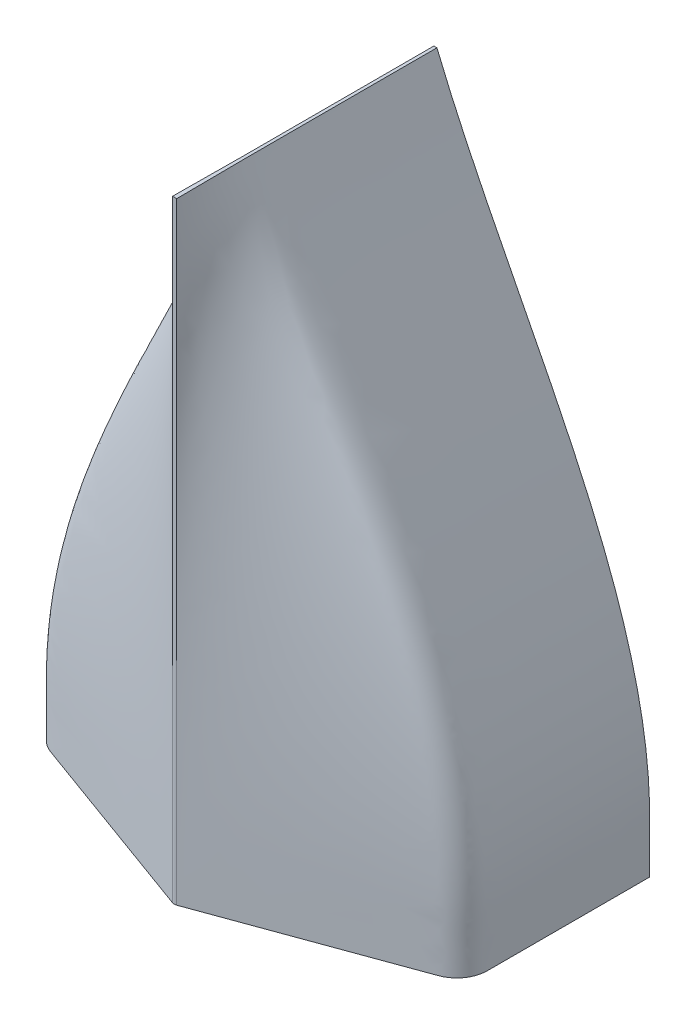
ISO-10303-21;
HEADER;
FILE_DESCRIPTION(('STEP AP214'),'2;1');
FILE_NAME('part.step','',(''),(''),'','','');
FILE_SCHEMA(('AUTOMOTIVE_DESIGN { 1 0 10303 214 1 1 1 1 }'));
ENDSEC;
DATA;
#1=APPLICATION_CONTEXT('core data for automotive mechanical design processes');
#2=APPLICATION_PROTOCOL_DEFINITION('international standard','automotive_design',2000,#1);
#3=PRODUCT_CONTEXT('',#1,'mechanical');
#4=PRODUCT('Part','Part','',(#3));
#5=PRODUCT_RELATED_PRODUCT_CATEGORY('part','',(#4));
#6=PRODUCT_DEFINITION_FORMATION('','',#4);
#7=PRODUCT_DEFINITION_CONTEXT('part definition',#1,'design');
#8=PRODUCT_DEFINITION('design','',#6,#7);
#9=PRODUCT_DEFINITION_SHAPE('','',#8);
#10=(LENGTH_UNIT() NAMED_UNIT(*) SI_UNIT(.MILLI.,.METRE.));
#11=(NAMED_UNIT(*) PLANE_ANGLE_UNIT() SI_UNIT($,.RADIAN.));
#12=(NAMED_UNIT(*) SI_UNIT($,.STERADIAN.) SOLID_ANGLE_UNIT());
#13=UNCERTAINTY_MEASURE_WITH_UNIT(LENGTH_MEASURE(1.E-05),#10,'distance_accuracy_value','');
#14=(GEOMETRIC_REPRESENTATION_CONTEXT(3) GLOBAL_UNCERTAINTY_ASSIGNED_CONTEXT((#13)) GLOBAL_UNIT_ASSIGNED_CONTEXT((#10,
#11,#12)) REPRESENTATION_CONTEXT('',''));
#15=CARTESIAN_POINT('',(0.,0.,0.));
#16=DIRECTION('',(0.,0.,1.));
#17=DIRECTION('',(1.,0.,0.));
#18=AXIS2_PLACEMENT_3D('',#15,#16,#17);
#19=CARTESIAN_POINT('',(69.3213828425096,0.,-0.817696380816725));
#20=DIRECTION('',(0.,-1.,0.));
#21=DIRECTION('',(0.,0.,-1.));
#22=AXIS2_PLACEMENT_3D('',#19,#20,#21);
#23=PLANE('',#22);
#24=DIRECTION('',(0.,0.,1.));
#25=VECTOR('',#24,1.);
#26=CARTESIAN_POINT('',(-60.6786171574904,0.,-0.81769638081678));
#27=LINE('',#26,#25);
#28=CARTESIAN_POINT('',(-60.6786171574904,0.,-53.8156209987196));
#29=VERTEX_POINT('',#28);
#30=CARTESIAN_POINT('',(-60.6786171574904,0.,-0.817696380816779));
#31=VERTEX_POINT('',#30);
#32=EDGE_CURVE('E506',#29,#31,#27,.T.);
#33=ORIENTED_EDGE('',*,*,#32,.F.);
#34=DIRECTION('',(-1.,0.,0.));
#35=VECTOR('',#34,1.);
#36=CARTESIAN_POINT('',(-60.6786171574904,0.,-53.8156209987196));
#37=LINE('',#36,#35);
#38=CARTESIAN_POINT('',(79.3213828425096,0.,-53.8156209987196));
#39=VERTEX_POINT('',#38);
#40=EDGE_CURVE('E373',#39,#29,#37,.T.);
#41=ORIENTED_EDGE('',*,*,#40,.F.);
#42=DIRECTION('',(0.,0.,-1.));
#43=VECTOR('',#42,1.);
#44=CARTESIAN_POINT('',(79.3213828425096,0.,-53.8156209987196));
#45=LINE('',#44,#43);
#46=CARTESIAN_POINT('',(79.3213828425096,0.,-0.817696380350896));
#47=VERTEX_POINT('',#46);
#48=EDGE_CURVE('E606',#47,#39,#45,.T.);
#49=ORIENTED_EDGE('',*,*,#48,.F.);
#50=CARTESIAN_POINT('',(69.3213828425096,0.,-0.817696380816725));
#51=DIRECTION('',(0.,1.,0.));
#52=DIRECTION('',(0.,0.,-1.));
#53=AXIS2_PLACEMENT_3D('',#50,#51,#52);
#54=CIRCLE('',#53,10.);
#55=CARTESIAN_POINT('',(72.7415842757666,0.,8.57922982704226));
#56=VERTEX_POINT('',#55);
#57=EDGE_CURVE('E598',#56,#47,#54,.T.);
#58=ORIENTED_EDGE('',*,*,#57,.F.);
#59=DIRECTION('',(0.939692620785911,0.,-0.342020143325663));
#60=VECTOR('',#59,1.);
#61=CARTESIAN_POINT('',(72.7415842757662,0.,8.5792298270424));
#62=LINE('',#61,#60);
#63=CARTESIAN_POINT('',(10.005423129161,0.,31.4133250965341));
#64=VERTEX_POINT('',#63);
#65=EDGE_CURVE('E456',#64,#56,#62,.T.);
#66=ORIENTED_EDGE('',*,*,#65,.F.);
#67=CARTESIAN_POINT('',(9.32138284250964,0.,29.5339398549623));
#68=DIRECTION('',(0.,1.,0.));
#69=DIRECTION('',(0.,0.,-1.));
#70=AXIS2_PLACEMENT_3D('',#67,#68,#69);
#71=CIRCLE('',#70,2.);
#72=CARTESIAN_POINT('',(8.6373425558583,0.,31.4133250965341));
#73=VERTEX_POINT('',#72);
#74=EDGE_CURVE('E471',#73,#64,#71,.T.);
#75=ORIENTED_EDGE('',*,*,#74,.F.);
#76=DIRECTION('',(0.939692620785911,0.,0.342020143325663));
#77=VECTOR('',#76,1.);
#78=CARTESIAN_POINT('',(8.6373425558583,0.,31.4133250965341));
#79=LINE('',#78,#77);
#80=CARTESIAN_POINT('',(-54.098818590747,0.,8.57922982704239));
#81=VERTEX_POINT('',#80);
#82=EDGE_CURVE('E288',#81,#73,#79,.T.);
#83=ORIENTED_EDGE('',*,*,#82,.F.);
#84=CARTESIAN_POINT('',(-50.6786171574904,0.,-0.817696380816728));
#85=DIRECTION('',(0.,1.,0.));
#86=DIRECTION('',(0.,0.,-1.));
#87=AXIS2_PLACEMENT_3D('',#84,#85,#86);
#88=CIRCLE('',#87,10.);
#89=EDGE_CURVE('E12',#31,#81,#88,.T.);
#90=ORIENTED_EDGE('',*,*,#89,.F.);
#91=EDGE_LOOP('',(#33,#41,#49,#58,#66,#75,#83,#90));
#92=FACE_BOUND('',#91,.T.);
#93=ADVANCED_FACE('F278',(#92),#23,.T.);
#94=CARTESIAN_POINT('',(0.,200.,0.));
#95=DIRECTION('',(0.,-1.,0.));
#96=DIRECTION('',(0.,0.,-1.));
#97=AXIS2_PLACEMENT_3D('',#94,#95,#96);
#98=PLANE('',#97);
#99=DIRECTION('',(0.,0.,-1.));
#100=VECTOR('',#99,1.);
#101=CARTESIAN_POINT('',(9.82138284250962,200.,-53.8156209987196));
#102=LINE('',#101,#100);
#103=CARTESIAN_POINT('',(9.82138284250962,200.,-0.81769638081678));
#104=VERTEX_POINT('',#103);
#105=CARTESIAN_POINT('',(9.82138284250962,200.,-53.8156209987196));
#106=VERTEX_POINT('',#105);
#107=EDGE_CURVE('E352',#104,#106,#102,.T.);
#108=ORIENTED_EDGE('',*,*,#107,.T.);
#109=DIRECTION('',(-1.,0.,0.));
#110=VECTOR('',#109,1.);
#111=CARTESIAN_POINT('',(8.82138284250962,200.,-53.8156209987196));
#112=LINE('',#111,#110);
#113=CARTESIAN_POINT('',(8.82138284250962,200.,-53.8156209987196));
#114=VERTEX_POINT('',#113);
#115=EDGE_CURVE('E344',#106,#114,#112,.T.);
#116=ORIENTED_EDGE('',*,*,#115,.T.);
#117=DIRECTION('',(0.,0.,1.));
#118=VECTOR('',#117,1.);
#119=CARTESIAN_POINT('',(8.82138284250962,200.,-53.8156209987196));
#120=LINE('',#119,#118);
#121=CARTESIAN_POINT('',(8.82138284250962,200.,-0.81769638081678));
#122=VERTEX_POINT('',#121);
#123=EDGE_CURVE('E348',#114,#122,#120,.T.);
#124=ORIENTED_EDGE('',*,*,#123,.T.);
#125=DIRECTION('',(0.,0.,1.));
#126=VECTOR('',#125,1.);
#127=CARTESIAN_POINT('',(8.82138284250962,200.,-0.81769638081678));
#128=LINE('',#127,#126);
#129=CARTESIAN_POINT('',(8.81956086525568,200.,8.57921666406728));
#130=VERTEX_POINT('',#129);
#131=EDGE_CURVE('E366',#122,#130,#128,.T.);
#132=ORIENTED_EDGE('',*,*,#131,.T.);
#133=DIRECTION('',(-0.00805962780546143,0.,0.999967520672365));
#134=VECTOR('',#133,1.);
#135=CARTESIAN_POINT('',(8.6373425558583,200.,31.4133250965341));
#136=LINE('',#135,#134);
#137=CARTESIAN_POINT('',(8.6373425558583,200.,31.4133250965341));
#138=VERTEX_POINT('',#137);
#139=EDGE_CURVE('E511',#130,#138,#136,.T.);
#140=ORIENTED_EDGE('',*,*,#139,.T.);
#141=DIRECTION('',(1.,0.,0.));
#142=VECTOR('',#141,1.);
#143=CARTESIAN_POINT('',(10.005423129161,200.,31.4133250965341));
#144=LINE('',#143,#142);
#145=CARTESIAN_POINT('',(10.005423129161,200.,31.4133250965341));
#146=VERTEX_POINT('',#145);
#147=EDGE_CURVE('E527',#138,#146,#144,.T.);
#148=ORIENTED_EDGE('',*,*,#147,.T.);
#149=DIRECTION('',(-0.00805962780546265,0.,-0.999967520672365));
#150=VECTOR('',#149,1.);
#151=CARTESIAN_POINT('',(9.82138284250962,200.,8.5792298270424));
#152=LINE('',#151,#150);
#153=CARTESIAN_POINT('',(9.82320481975324,200.,8.57921666263926));
#154=VERTEX_POINT('',#153);
#155=EDGE_CURVE('E530',#146,#154,#152,.T.);
#156=ORIENTED_EDGE('',*,*,#155,.T.);
#157=DIRECTION('',(0.,0.,-1.));
#158=VECTOR('',#157,1.);
#159=CARTESIAN_POINT('',(9.82138284250962,200.,-0.81769638081678));
#160=LINE('',#159,#158);
#161=EDGE_CURVE('E557',#154,#104,#160,.T.);
#162=ORIENTED_EDGE('',*,*,#161,.T.);
#163=EDGE_LOOP('',(#108,#116,#124,#132,#140,#148,#156,#162));
#164=FACE_BOUND('',#163,.T.);
#165=ADVANCED_FACE('F347',(#164),#98,.F.);
#166=CARTESIAN_POINT('',(8.82138284250962,200.,-53.8156209987196));
#167=DIRECTION('',(0.,0.,-1.));
#168=DIRECTION('',(1.,0.,0.));
#169=AXIS2_PLACEMENT_3D('',#166,#167,#168);
#170=PLANE('',#169);
#171=ORIENTED_EDGE('',*,*,#115,.F.);
#172=CARTESIAN_POINT('',(9.82138284250962,200.,-53.8156209987196));
#173=CARTESIAN_POINT('',(34.0634562478761,140.393372464945,-53.8156209987196));
#174=CARTESIAN_POINT('',(80.362552085754,79.4719654991847,-53.8156209987195));
#175=CARTESIAN_POINT('',(79.2869193069982,9.99620187961251,-53.8156209987196));
#176=CARTESIAN_POINT('',(79.3213828425096,3.33333333333333,-53.8156209987196));
#177=CARTESIAN_POINT('',(79.3213828425096,0.,-53.8156209987196));
#178=B_SPLINE_CURVE_WITH_KNOTS('',3,(#172,#173,#174,#175,#176,#177),.UNSPECIFIED.,.F.,.F.,(4,1,
1,4),(0.,0.903879271275143,0.951939635637572,1.),.UNSPECIFIED.);
#179=EDGE_CURVE('E375',#106,#39,#178,.T.);
#180=ORIENTED_EDGE('',*,*,#179,.T.);
#181=ORIENTED_EDGE('',*,*,#40,.T.);
#182=CARTESIAN_POINT('',(8.82138284250962,200.,-53.8156209987196));
#183=CARTESIAN_POINT('',(-15.4206905628568,140.393372464945,-53.8156209987196));
#184=CARTESIAN_POINT('',(-61.7197864007349,79.4719654991847,-53.8156209987195));
#185=CARTESIAN_POINT('',(-60.6441536219789,9.99620187961251,-53.8156209987196));
#186=CARTESIAN_POINT('',(-60.6786171574904,3.33333333333333,-53.8156209987196));
#187=CARTESIAN_POINT('',(-60.6786171574904,0.,-53.8156209987196));
#188=B_SPLINE_CURVE_WITH_KNOTS('',3,(#182,#183,#184,#185,#186,#187),.UNSPECIFIED.,.F.,.F.,(4,1,
1,4),(0.,0.903879271275143,0.951939635637572,1.),.UNSPECIFIED.);
#189=EDGE_CURVE('E358',#29,#114,#188,.F.);
#190=ORIENTED_EDGE('',*,*,#189,.T.);
#191=EDGE_LOOP('',(#171,#180,#181,#190));
#192=FACE_BOUND('',#191,.T.);
#193=ADVANCED_FACE('F371',(#192),#170,.T.);
#194=CARTESIAN_POINT('',(9.82138284250962,200.,-53.8156209987196));
#195=CARTESIAN_POINT('',(34.0634562478761,140.393372464945,-53.8156209987196));
#196=CARTESIAN_POINT('',(80.362552085754,79.4719654991847,-53.8156209987195));
#197=CARTESIAN_POINT('',(79.2869193069982,9.99620187961251,-53.8156209987196));
#198=CARTESIAN_POINT('',(79.3213828425096,3.33333333333333,-53.8156209987196));
#199=CARTESIAN_POINT('',(79.3213828425096,0.,-53.8156209987196));
#200=CARTESIAN_POINT('',(9.82138284250962,200.,-50.482676560163));
#201=CARTESIAN_POINT('',(34.0622581634669,140.393685940455,-49.9923464884705));
#202=CARTESIAN_POINT('',(80.3625796479676,79.4719582876069,-48.5188687278219));
#203=CARTESIAN_POINT('',(79.2869183946668,9.99620211832151,-48.5531009509234));
#204=CARTESIAN_POINT('',(79.3213828425096,3.33333333333333,-48.55200414218));
#205=CARTESIAN_POINT('',(79.3213828425096,0.,-48.55200414218));
#206=CARTESIAN_POINT('',(9.82138284250962,200.,-43.1777571417248));
#207=CARTESIAN_POINT('',(34.0598619946487,140.394312891473,-41.7067669266471));
#208=CARTESIAN_POINT('',(80.3626347723949,79.4719438644514,-39.135492713872));
#209=CARTESIAN_POINT('',(79.2869165700042,9.99620259573951,-39.1952292330497));
#210=CARTESIAN_POINT('',(79.3213828425097,3.33333333333334,-39.1933152604648));
#211=CARTESIAN_POINT('',(79.3213828425097,0.,-39.1933152604648));
#212=CARTESIAN_POINT('',(9.82138284250962,200.,-29.7836860581526));
#213=CARTESIAN_POINT('',(34.0760346688234,140.394527772832,-28.5976716330076));
#214=CARTESIAN_POINT('',(80.3622627162224,79.4719389210551,-26.3043908397963));
#215=CARTESIAN_POINT('',(79.2869288853613,9.99620275936987,-26.3576689426929));
#216=CARTESIAN_POINT('',(79.3213828425096,3.33333333333333,-26.3559618993344));
#217=CARTESIAN_POINT('',(79.3213828425096,0.,-26.3559618993344));
#218=CARTESIAN_POINT('',(9.82138284250962,200.,-14.5809241513471));
#219=CARTESIAN_POINT('',(34.0152555740289,140.391860248948,-14.3801097762544));
#220=CARTESIAN_POINT('',(80.3636609535897,79.4720002880693,-13.8708825002475));
#221=CARTESIAN_POINT('',(79.2868826025851,9.99620072807257,-13.882713002334));
#222=CARTESIAN_POINT('',(79.3213828425096,3.33333333333333,-13.8823339501734));
#223=CARTESIAN_POINT('',(79.3213828425096,0.,-13.8823339501734));
#224=CARTESIAN_POINT('',(9.82138284250962,200.,-5.12492127300493));
#225=CARTESIAN_POINT('',(34.1674479525071,140.396379322998,-5.0864307385206));
#226=CARTESIAN_POINT('',(80.3601597321366,79.4718963257082,-5.32498140443458));
#227=CARTESIAN_POINT('',(79.2869984958182,9.99620416930996,-5.31943933258615));
#228=CARTESIAN_POINT('',(79.3213828425096,3.33333333333334,-5.31961690191438));
#229=CARTESIAN_POINT('',(79.3213828425096,0.,-5.31961690191438));
#230=CARTESIAN_POINT('',(9.82138284250962,200.,0.074649629141914));
#231=CARTESIAN_POINT('',(34.0419118463138,140.392749521437,0.0666753794124148));
#232=CARTESIAN_POINT('',(80.363047719778,79.4719798301466,0.116096925115402));
#233=CARTESIAN_POINT('',(79.2869029011152,9.99620140524619,0.114948750759664));
#234=CARTESIAN_POINT('',(79.3213828425096,3.33333333333333,0.114985538544923));
#235=CARTESIAN_POINT('',(79.3213828425096,0.,0.114985538544923));
#236=CARTESIAN_POINT('',(9.82138284250965,200.,2.07032083784979));
#237=CARTESIAN_POINT('',(33.9833638796793,140.391051554823,2.05006110407094));
#238=CARTESIAN_POINT('',(80.097903700917,79.4720188922679,1.98179279714276));
#239=CARTESIAN_POINT('',(79.0265585761082,9.99620011225871,1.98337882441507));
#240=CARTESIAN_POINT('',(79.0608847341457,3.33333333333333,1.98332800771601));
#241=CARTESIAN_POINT('',(79.0608847341457,0.,1.98332800771601));
#242=CARTESIAN_POINT('',(9.8213828425096,200.,4.85022373715482));
#243=CARTESIAN_POINT('',(33.5616332885196,140.378909988786,4.77473540721883));
#244=CARTESIAN_POINT('',(78.8930108862218,79.4722982118494,4.63712570105081));
#245=CARTESIAN_POINT('',(77.8398603922902,9.99619086655693,4.64032268595842));
#246=CARTESIAN_POINT('',(77.8736035899347,3.33333333333333,4.64022025378541));
#247=CARTESIAN_POINT('',(77.8736035899347,0.,4.64022025378541));
#248=CARTESIAN_POINT('',(9.82138284250963,200.,6.6083811124841));
#249=CARTESIAN_POINT('',(32.9808354071925,140.362406798836,6.59941989288879));
#250=CARTESIAN_POINT('',(77.1855583077032,79.4726778716149,6.58635309607367));
#251=CARTESIAN_POINT('',(76.1585825521916,9.99617829951475,6.586656667336));
#252=CARTESIAN_POINT('',(76.1914871048591,3.33333333333333,6.58664694083901));
#253=CARTESIAN_POINT('',(76.1914871048591,0.,6.58664694083901));
#254=CARTESIAN_POINT('',(9.82138284250962,200.,7.79612244759282));
#255=CARTESIAN_POINT('',(32.3632216015056,140.345165817862,7.82101843325157));
#256=CARTESIAN_POINT('',(75.3563930488216,79.4730745044362,7.8599775526634));
#257=CARTESIAN_POINT('',(74.3575643755073,9.99616517065082,7.8590724441486));
#258=CARTESIAN_POINT('',(74.3895670888241,3.33333333333333,7.85910144404527));
#259=CARTESIAN_POINT('',(74.3895670888241,0.,7.85910144404527));
#260=CARTESIAN_POINT('',(9.82138284250962,200.,8.32702778065809));
#261=CARTESIAN_POINT('',(31.9824590240575,140.334687906767,8.33468912144861));
#262=CARTESIAN_POINT('',(74.2733360882162,79.4733155512447,8.3686286337514));
#263=CARTESIAN_POINT('',(73.2908233028298,9.99615719180847,8.36784014206994));
#264=CARTESIAN_POINT('',(73.3223032511341,3.33333333333333,8.36786540553494));
#265=CARTESIAN_POINT('',(73.3223032511341,0.,8.36786540553494));
#266=CARTESIAN_POINT('',(9.83896553445853,200.,10.7607351396051));
#267=CARTESIAN_POINT('',(30.1324001579765,140.283754978419,10.6944884214369));
#268=CARTESIAN_POINT('',(68.5829719999392,79.4744872752377,10.4009549976643));
#269=CARTESIAN_POINT('',(67.6896781961046,9.99611840680622,10.4077744434128));
#270=CARTESIAN_POINT('',(67.7182995465679,3.33333333333333,10.4075559467145));
#271=CARTESIAN_POINT('',(67.7182995465679,0.,10.4075559467145));
#272=CARTESIAN_POINT('',(9.86831104105107,200.,14.4016667283226));
#273=CARTESIAN_POINT('',(26.3414765776926,140.186607783641,14.3463667761305));
#274=CARTESIAN_POINT('',(57.7430657141222,79.4767221692966,14.2940881479467));
#275=CARTESIAN_POINT('',(57.0135357315403,9.9960444300236,14.2953026987945));
#276=CARTESIAN_POINT('',(57.0369100493911,3.33333333333333,14.2952637842904));
#277=CARTESIAN_POINT('',(57.0369100493911,0.,14.2952637842904));
#278=CARTESIAN_POINT('',(9.90802822621158,200.,19.3294247007361));
#279=CARTESIAN_POINT('',(20.5039224252382,140.075160229472,19.7040588375884));
#280=CARTESIAN_POINT('',(40.5357240313382,79.4792860464862,20.4826724956339));
#281=CARTESIAN_POINT('',(40.0703399447784,9.99595956363601,20.4645835382272));
#282=CARTESIAN_POINT('',(40.0852509639574,3.33333333333334,20.4651631128165));
#283=CARTESIAN_POINT('',(40.0852509639574,0.,20.4651631128165));
#284=CARTESIAN_POINT('',(9.95061349002079,200.,24.6130285713264));
#285=CARTESIAN_POINT('',(14.8307555466657,140.009734278117,25.3291132058318));
#286=CARTESIAN_POINT('',(24.1589897059,79.4807911858812,26.3614133052045));
#287=CARTESIAN_POINT('',(23.9422737150583,9.995909742317,26.3374306376319));
#288=CARTESIAN_POINT('',(23.949217348047,3.33333333333333,26.3381990481265));
#289=CARTESIAN_POINT('',(23.949217348047,0.,26.3381990481265));
#290=CARTESIAN_POINT('',(9.98135343470422,200.,28.4269697374265));
#291=CARTESIAN_POINT('',(11.6080674535859,140.003244759372,28.665664615595));
#292=CARTESIAN_POINT('',(14.5024906840442,79.4809404787859,29.826317645691));
#293=CARTESIAN_POINT('',(14.4352466818465,9.99590480060234,29.7993530490539));
#294=CARTESIAN_POINT('',(14.4374011960111,3.33333333333333,29.80021700128));
#295=CARTESIAN_POINT('',(14.4374011960111,0.,29.80021700128));
#296=CARTESIAN_POINT('',(10.005423129161,200.,31.4133250965341));
#297=CARTESIAN_POINT('',(10.005423129161,140.,31.4133250965341));
#298=CARTESIAN_POINT('',(10.0054231291609,79.4810151252383,31.4133250965341));
#299=CARTESIAN_POINT('',(10.005423129161,9.99590232974501,31.4133250965341));
#300=CARTESIAN_POINT('',(10.005423129161,3.33333333333333,31.4133250965341));
#301=CARTESIAN_POINT('',(10.005423129161,0.,31.4133250965341));
#302=B_SPLINE_SURFACE_WITH_KNOTS('',3,3,((#194,#195,#196,#197,#198,#199),(#200,#201,#202,#203,
#204,#205),(#206,#207,#208,#209,#210,#211),(#212,#213,#214,#215,#216,#217),(#218,#219,#220,#221,
#222,#223),(#224,#225,#226,#227,#228,#229),(#230,#231,#232,#233,#234,#235),(#236,#237,#238,#239,
#240,#241),(#242,#243,#244,#245,#246,#247),(#248,#249,#250,#251,#252,#253),(#254,#255,#256,#257,
#258,#259),(#260,#261,#262,#263,#264,#265),(#266,#267,#268,#269,#270,#271),(#272,#273,#274,#275,
#276,#277),(#278,#279,#280,#281,#282,#283),(#284,#285,#286,#287,#288,#289),(#290,#291,#292,#293,
#294,#295),(#296,#297,#298,#299,#300,#301)),.UNSPECIFIED.,.F.,.F.,.F.,(4,1,1,1,2,1,1,1,1,2,1,1,
1,4),(4,1,1,4),(0.,0.118865670859502,0.237731341719005,0.356597012578507,0.475462683438009,
0.500088587533455,0.5247144916289,0.549340395724345,0.561653347772068,0.573966299819791,
0.680474724864843,0.786983149909895,0.893491574954948,1.),(0.,0.903879271275143,
0.951939635637572,1.),.UNSPECIFIED.);
#303=DIRECTION('',(0.,-1.,0.));
#304=VECTOR('',#303,1.);
#305=CARTESIAN_POINT('',(10.005423129161,101.469587420133,31.4133250965341));
#306=LINE('',#305,#304);
#307=EDGE_CURVE('E377',#146,#64,#306,.T.);
#308=ORIENTED_EDGE('',*,*,#107,.F.);
#309=ORIENTED_EDGE('',*,*,#161,.F.);
#310=ORIENTED_EDGE('',*,*,#155,.F.);
#311=ORIENTED_EDGE('',*,*,#307,.T.);
#312=ORIENTED_EDGE('',*,*,#65,.T.);
#313=ORIENTED_EDGE('',*,*,#57,.T.);
#314=ORIENTED_EDGE('',*,*,#48,.T.);
#315=ORIENTED_EDGE('',*,*,#179,.F.);
#316=EDGE_LOOP('',(#308,#309,#310,#311,#312,#313,#314,#315));
#317=FACE_BOUND('',#316,.T.);
#318=ADVANCED_FACE('F406',(#317),#302,.T.);
#319=CARTESIAN_POINT('',(8.6373425558583,200.,31.4133250965341));
#320=CARTESIAN_POINT('',(8.6373425558583,140.,31.4133250965341));
#321=CARTESIAN_POINT('',(8.63734255585828,79.4810151252383,31.4133250965341));
#322=CARTESIAN_POINT('',(8.6373425558583,9.99590232974501,31.4133250965341));
#323=CARTESIAN_POINT('',(8.6373425558583,3.33333333333333,31.4133250965341));
#324=CARTESIAN_POINT('',(8.6373425558583,0.,31.4133250965341));
#325=CARTESIAN_POINT('',(8.66141225031505,200.,28.4269697374265));
#326=CARTESIAN_POINT('',(7.0346982314334,140.003244759372,28.665664615595));
#327=CARTESIAN_POINT('',(4.14027500097503,79.4809404787859,29.826317645691));
#328=CARTESIAN_POINT('',(4.20751900317274,9.99590480060234,29.7993530490539));
#329=CARTESIAN_POINT('',(4.2053644890082,3.33333333333333,29.80021700128));
#330=CARTESIAN_POINT('',(4.2053644890082,0.,29.80021700128));
#331=CARTESIAN_POINT('',(8.69215219499848,200.,24.6130285713264));
#332=CARTESIAN_POINT('',(3.81201013835354,140.009734278117,25.3291132058318));
#333=CARTESIAN_POINT('',(-5.51622402088083,79.4807911858813,26.3614133052046));
#334=CARTESIAN_POINT('',(-5.29950803003907,9.99590974231701,26.3374306376319));
#335=CARTESIAN_POINT('',(-5.30645166302775,3.33333333333333,26.3381990481266));
#336=CARTESIAN_POINT('',(-5.30645166302775,0.,26.3381990481266));
#337=CARTESIAN_POINT('',(8.73473745880767,200.,19.3294247007362));
#338=CARTESIAN_POINT('',(-1.86115674021887,140.075160229473,19.7040588375884));
#339=CARTESIAN_POINT('',(-21.8929583463189,79.4792860464861,20.4826724956338));
#340=CARTESIAN_POINT('',(-21.4275742597591,9.995959563636,20.4645835382271));
#341=CARTESIAN_POINT('',(-21.4424852789381,3.33333333333333,20.4651631128164));
#342=CARTESIAN_POINT('',(-21.4424852789381,0.,20.4651631128164));
#343=CARTESIAN_POINT('',(8.77445464396818,200.,14.4016667283226));
#344=CARTESIAN_POINT('',(-7.69871089267341,140.186607783641,14.3463667761305));
#345=CARTESIAN_POINT('',(-39.1003000291031,79.4767221692968,14.2940881479468));
#346=CARTESIAN_POINT('',(-38.3707700465211,9.99604443002362,14.2953026987946));
#347=CARTESIAN_POINT('',(-38.3941443643719,3.33333333333334,14.2952637842904));
#348=CARTESIAN_POINT('',(-38.3941443643719,0.,14.2952637842904));
#349=CARTESIAN_POINT('',(8.80380015056072,200.,10.760735139605));
#350=CARTESIAN_POINT('',(-11.4896344729573,140.283754978418,10.6944884214369));
#351=CARTESIAN_POINT('',(-49.94020631492,79.4744872752377,10.4009549976643));
#352=CARTESIAN_POINT('',(-49.0469125110854,9.99611840680622,10.4077744434128));
#353=CARTESIAN_POINT('',(-49.0755338615487,3.33333333333333,10.4075559467145));
#354=CARTESIAN_POINT('',(-49.0755338615487,0.,10.4075559467145));
#355=CARTESIAN_POINT('',(8.82138284250962,200.,8.32702778065808));
#356=CARTESIAN_POINT('',(-13.3396933390383,140.334687906767,8.33468912144861));
#357=CARTESIAN_POINT('',(-55.6305704031969,79.4733155512447,8.36862863375139));
#358=CARTESIAN_POINT('',(-54.6480576178105,9.99615719180847,8.36784014206993));
#359=CARTESIAN_POINT('',(-54.6795375661148,3.33333333333333,8.36786540553494));
#360=CARTESIAN_POINT('',(-54.6795375661148,0.,8.36786540553494));
#361=CARTESIAN_POINT('',(8.82138284250962,200.,7.79612244759282));
#362=CARTESIAN_POINT('',(-13.7204559164863,140.345165817863,7.82101843325157));
#363=CARTESIAN_POINT('',(-56.7136273638026,79.4730745044361,7.8599775526634));
#364=CARTESIAN_POINT('',(-55.7147986904881,9.99616517065081,7.8590724441486));
#365=CARTESIAN_POINT('',(-55.7468014038049,3.33333333333333,7.85910144404527));
#366=CARTESIAN_POINT('',(-55.7468014038049,0.,7.85910144404527));
#367=CARTESIAN_POINT('',(8.82138284250962,200.,6.60838111248409));
#368=CARTESIAN_POINT('',(-14.3380697221732,140.362406798836,6.59941989288879));
#369=CARTESIAN_POINT('',(-58.5427926226838,79.4726778716149,6.58635309607366));
#370=CARTESIAN_POINT('',(-57.5158168671722,9.99617829951476,6.58665666733599));
#371=CARTESIAN_POINT('',(-57.5487214198397,3.33333333333334,6.586646940839));
#372=CARTESIAN_POINT('',(-57.5487214198397,0.,6.586646940839));
#373=CARTESIAN_POINT('',(8.82138284250962,200.,4.85022373715481));
#374=CARTESIAN_POINT('',(-14.9188676035003,140.378909988786,4.77473540721883));
#375=CARTESIAN_POINT('',(-60.2502452012027,79.4722982118493,4.63712570105081));
#376=CARTESIAN_POINT('',(-59.197094707271,9.99619086655692,4.64032268595842));
#377=CARTESIAN_POINT('',(-59.2308379049155,3.33333333333333,4.6402202537854));
#378=CARTESIAN_POINT('',(-59.2308379049156,0.,4.6402202537854));
#379=CARTESIAN_POINT('',(8.82138284250962,200.,2.07032083784979));
#380=CARTESIAN_POINT('',(-15.3405981946601,140.391051554822,2.05006110407094));
#381=CARTESIAN_POINT('',(-61.4551380158977,79.4720188922679,1.98179279714275));
#382=CARTESIAN_POINT('',(-60.3837928910889,9.99620011225872,1.98337882441506));
#383=CARTESIAN_POINT('',(-60.4181190491264,3.33333333333334,1.983328007716));
#384=CARTESIAN_POINT('',(-60.4181190491264,0.,1.983328007716));
#385=CARTESIAN_POINT('',(8.82138284250962,200.,0.0746496291419115));
#386=CARTESIAN_POINT('',(-15.3991461612946,140.392749521437,0.0666753794124094));
#387=CARTESIAN_POINT('',(-61.7202820347588,79.4719798301466,0.116096925115396));
#388=CARTESIAN_POINT('',(-60.6441372160959,9.99620140524619,0.114948750759658));
#389=CARTESIAN_POINT('',(-60.6786171574904,3.33333333333333,0.114985538544917));
#390=CARTESIAN_POINT('',(-60.6786171574904,0.,0.114985538544917));
#391=CARTESIAN_POINT('',(8.82138284250962,200.,-5.12492127300493));
#392=CARTESIAN_POINT('',(-15.5246822674879,140.396379322998,-5.0864307385206));
#393=CARTESIAN_POINT('',(-61.7173940471172,79.4718963257082,-5.32498140443455));
#394=CARTESIAN_POINT('',(-60.644232810799,9.99620416930996,-5.31943933258613));
#395=CARTESIAN_POINT('',(-60.6786171574904,3.33333333333333,-5.31961690191436));
#396=CARTESIAN_POINT('',(-60.6786171574904,0.,-5.31961690191436));
#397=CARTESIAN_POINT('',(8.82138284250961,200.,-14.580924151347));
#398=CARTESIAN_POINT('',(-15.3724898890097,140.391860248947,-14.3801097762544));
#399=CARTESIAN_POINT('',(-61.7208952685706,79.4720002880693,-13.8708825002474));
#400=CARTESIAN_POINT('',(-60.6441169175658,9.99620072807257,-13.8827130023339));
#401=CARTESIAN_POINT('',(-60.6786171574904,3.33333333333333,-13.8823339501733));
#402=CARTESIAN_POINT('',(-60.6786171574904,0.,-13.8823339501733));
#403=CARTESIAN_POINT('',(8.82138284250963,200.,-29.7836860581526));
#404=CARTESIAN_POINT('',(-15.4332689838042,140.394527772832,-28.5976716330076));
#405=CARTESIAN_POINT('',(-61.7194970312033,79.4719389210553,-26.3043908397964));
#406=CARTESIAN_POINT('',(-60.6441632003421,9.99620275936989,-26.357668942693));
#407=CARTESIAN_POINT('',(-60.6786171574904,3.33333333333334,-26.3559618993345));
#408=CARTESIAN_POINT('',(-60.6786171574904,0.,-26.3559618993345));
#409=CARTESIAN_POINT('',(8.82138284250962,200.,-43.1777571417248));
#410=CARTESIAN_POINT('',(-15.4170963096294,140.394312891473,-41.7067669266471));
#411=CARTESIAN_POINT('',(-61.7198690873754,79.4719438644512,-39.1354927138718));
#412=CARTESIAN_POINT('',(-60.6441508849849,9.9962025957395,-39.1952292330496));
#413=CARTESIAN_POINT('',(-60.6786171574904,3.33333333333333,-39.1933152604647));
#414=CARTESIAN_POINT('',(-60.6786171574904,0.,-39.1933152604647));
#415=CARTESIAN_POINT('',(8.82138284250962,200.,-50.482676560163));
#416=CARTESIAN_POINT('',(-15.4194924784477,140.393685940455,-49.9923464884705));
#417=CARTESIAN_POINT('',(-61.7198139629484,79.4719582876069,-48.5188687278219));
#418=CARTESIAN_POINT('',(-60.6441527096476,9.99620211832151,-48.5531009509234));
#419=CARTESIAN_POINT('',(-60.6786171574904,3.33333333333333,-48.55200414218));
#420=CARTESIAN_POINT('',(-60.6786171574904,0.,-48.55200414218));
#421=CARTESIAN_POINT('',(8.82138284250962,200.,-53.8156209987196));
#422=CARTESIAN_POINT('',(-15.4206905628568,140.393372464945,-53.8156209987196));
#423=CARTESIAN_POINT('',(-61.7197864007349,79.4719654991847,-53.8156209987194));
#424=CARTESIAN_POINT('',(-60.6441536219789,9.99620187961251,-53.8156209987196));
#425=CARTESIAN_POINT('',(-60.6786171574904,3.33333333333333,-53.8156209987196));
#426=CARTESIAN_POINT('',(-60.6786171574904,0.,-53.8156209987196));
#427=B_SPLINE_SURFACE_WITH_KNOTS('',3,3,((#319,#320,#321,#322,#323,#324),(#325,#326,#327,#328,
#329,#330),(#331,#332,#333,#334,#335,#336),(#337,#338,#339,#340,#341,#342),(#343,#344,#345,#346,
#347,#348),(#349,#350,#351,#352,#353,#354),(#355,#356,#357,#358,#359,#360),(#361,#362,#363,#364,
#365,#366),(#367,#368,#369,#370,#371,#372),(#373,#374,#375,#376,#377,#378),(#379,#380,#381,#382,
#383,#384),(#385,#386,#387,#388,#389,#390),(#391,#392,#393,#394,#395,#396),(#397,#398,#399,#400,
#401,#402),(#403,#404,#405,#406,#407,#408),(#409,#410,#411,#412,#413,#414),(#415,#416,#417,#418,
#419,#420),(#421,#422,#423,#424,#425,#426)),.UNSPECIFIED.,.F.,.F.,.F.,(4,1,1,1,2,1,1,1,1,2,1,1,
1,4),(4,1,1,4),(0.,0.106508425045052,0.213016850090105,0.319525275135157,0.426033700180209,
0.438346652227932,0.450659604275655,0.4752855083711,0.499911412466546,0.524537316561991,
0.643402987421493,0.762268658280995,0.881134329140498,1.),(0.,0.903879271275143,
0.951939635637572,1.),.UNSPECIFIED.);
#428=DIRECTION('',(0.,-1.,0.));
#429=VECTOR('',#428,1.);
#430=CARTESIAN_POINT('',(8.6373425558583,101.469587420133,31.4133250965341));
#431=LINE('',#430,#429);
#432=EDGE_CURVE('E499',#138,#73,#431,.T.);
#433=ORIENTED_EDGE('',*,*,#139,.F.);
#434=ORIENTED_EDGE('',*,*,#131,.F.);
#435=ORIENTED_EDGE('',*,*,#123,.F.);
#436=ORIENTED_EDGE('',*,*,#189,.F.);
#437=ORIENTED_EDGE('',*,*,#32,.T.);
#438=ORIENTED_EDGE('',*,*,#89,.T.);
#439=ORIENTED_EDGE('',*,*,#82,.T.);
#440=ORIENTED_EDGE('',*,*,#432,.F.);
#441=EDGE_LOOP('',(#433,#434,#435,#436,#437,#438,#439,#440));
#442=FACE_BOUND('',#441,.T.);
#443=ADVANCED_FACE('F365',(#442),#427,.T.);
#444=CARTESIAN_POINT('',(10.005423129161,200.,31.4133250965341));
#445=CARTESIAN_POINT('',(10.005423129161,140.,31.4133250965341));
#446=CARTESIAN_POINT('',(10.005423129161,79.4810151252383,31.4133250965341));
#447=CARTESIAN_POINT('',(10.005423129161,9.99590232974501,31.4133250965341));
#448=CARTESIAN_POINT('',(10.005423129161,3.33333333333333,31.4133250965341));
#449=CARTESIAN_POINT('',(10.005423129161,0.,31.4133250965341));
#450=CARTESIAN_POINT('',(9.54939627139341,200.,31.4133250965341));
#451=CARTESIAN_POINT('',(9.54939627139341,140.,31.4133250965341));
#452=CARTESIAN_POINT('',(9.56392096006703,79.4810151252383,31.5778371580296));
#453=CARTESIAN_POINT('',(9.5635835186774,9.99590232974501,31.5740151705233));
#454=CARTESIAN_POINT('',(9.56359433038149,3.33333333333333,31.5741376279314));
#455=CARTESIAN_POINT('',(9.56359433038149,0.,31.5741376279314));
#456=CARTESIAN_POINT('',(9.09336941362586,200.,31.4133250965341));
#457=CARTESIAN_POINT('',(9.09336941362586,140.,31.4133250965341));
#458=CARTESIAN_POINT('',(9.07884472495222,79.4810151252383,31.5778371580296));
#459=CARTESIAN_POINT('',(9.07918216634187,9.99590232974501,31.5740151705233));
#460=CARTESIAN_POINT('',(9.07917135463777,3.33333333333333,31.5741376279314));
#461=CARTESIAN_POINT('',(9.07917135463777,0.,31.5741376279314));
#462=CARTESIAN_POINT('',(8.6373425558583,200.,31.4133250965341));
#463=CARTESIAN_POINT('',(8.6373425558583,140.,31.4133250965341));
#464=CARTESIAN_POINT('',(8.63734255585828,79.4810151252383,31.4133250965341));
#465=CARTESIAN_POINT('',(8.6373425558583,9.99590232974501,31.4133250965341));
#466=CARTESIAN_POINT('',(8.6373425558583,3.33333333333333,31.4133250965341));
#467=CARTESIAN_POINT('',(8.6373425558583,0.,31.4133250965341));
#468=B_SPLINE_SURFACE_WITH_KNOTS('',3,3,((#444,#445,#446,#447,#448,#449),(#450,#451,#452,#453,
#454,#455),(#456,#457,#458,#459,#460,#461),(#462,#463,#464,#465,#466,#467)),.UNSPECIFIED.,.F.,
.F.,.F.,(4,4),(4,1,1,4),(0.,1.),(0.,0.903879271275143,0.951939635637572,1.),.UNSPECIFIED.);
#469=ORIENTED_EDGE('',*,*,#147,.F.);
#470=ORIENTED_EDGE('',*,*,#432,.T.);
#471=ORIENTED_EDGE('',*,*,#74,.T.);
#472=ORIENTED_EDGE('',*,*,#307,.F.);
#473=EDGE_LOOP('',(#469,#470,#471,#472));
#474=FACE_BOUND('',#473,.T.);
#475=ADVANCED_FACE('F476',(#474),#468,.T.);
#476=CLOSED_SHELL('',(#93,#165,#193,#318,#443,#475));
#477=MANIFOLD_SOLID_BREP('B2',#476);
#478=ADVANCED_BREP_SHAPE_REPRESENTATION('',(#18,#477),#14);
#479=SHAPE_DEFINITION_REPRESENTATION(#9,#478);
ENDSEC;
END-ISO-10303-21;
